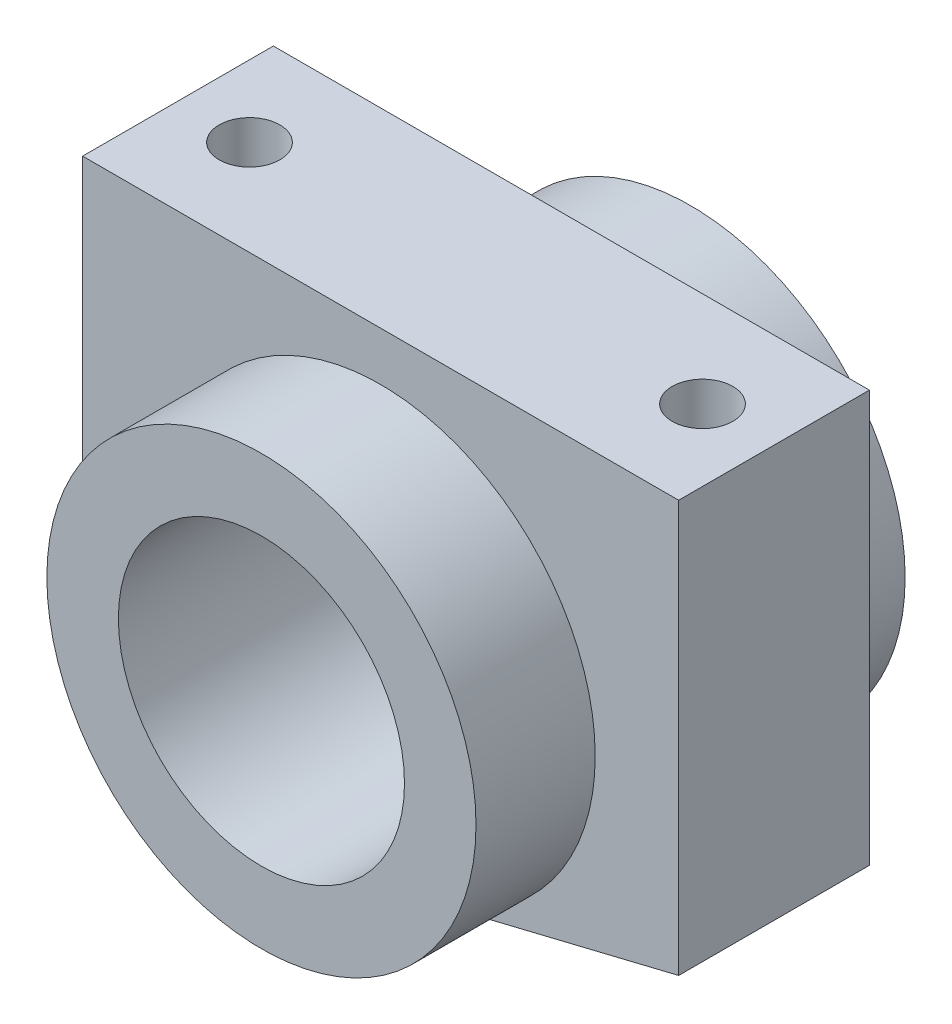
ISO-10303-21;
HEADER;
FILE_DESCRIPTION(('STEP AP214'),'2;1');
FILE_NAME('part.step','',(''),(''),'','','');
FILE_SCHEMA(('AUTOMOTIVE_DESIGN { 1 0 10303 214 1 1 1 1 }'));
ENDSEC;
DATA;
#1=APPLICATION_CONTEXT('core data for automotive mechanical design processes');
#2=APPLICATION_PROTOCOL_DEFINITION('international standard','automotive_design',2000,#1);
#3=PRODUCT_CONTEXT('',#1,'mechanical');
#4=PRODUCT('Part','Part','',(#3));
#5=PRODUCT_RELATED_PRODUCT_CATEGORY('part','',(#4));
#6=PRODUCT_DEFINITION_FORMATION('','',#4);
#7=PRODUCT_DEFINITION_CONTEXT('part definition',#1,'design');
#8=PRODUCT_DEFINITION('design','',#6,#7);
#9=PRODUCT_DEFINITION_SHAPE('','',#8);
#10=(LENGTH_UNIT() NAMED_UNIT(*) SI_UNIT(.MILLI.,.METRE.));
#11=(NAMED_UNIT(*) PLANE_ANGLE_UNIT() SI_UNIT($,.RADIAN.));
#12=(NAMED_UNIT(*) SI_UNIT($,.STERADIAN.) SOLID_ANGLE_UNIT());
#13=UNCERTAINTY_MEASURE_WITH_UNIT(LENGTH_MEASURE(1.E-05),#10,'distance_accuracy_value','');
#14=(GEOMETRIC_REPRESENTATION_CONTEXT(3) GLOBAL_UNCERTAINTY_ASSIGNED_CONTEXT((#13)) GLOBAL_UNIT_ASSIGNED_CONTEXT((#10,
#11,#12)) REPRESENTATION_CONTEXT('',''));
#15=CARTESIAN_POINT('',(0.,0.,0.));
#16=DIRECTION('',(0.,0.,1.));
#17=DIRECTION('',(1.,0.,0.));
#18=AXIS2_PLACEMENT_3D('',#15,#16,#17);
#19=CARTESIAN_POINT('',(0.,0.,6.35));
#20=DIRECTION('',(0.,0.,-1.));
#21=DIRECTION('',(-1.,0.,0.));
#22=AXIS2_PLACEMENT_3D('',#19,#20,#21);
#23=PLANE('',#22);
#24=DIRECTION('',(0.,1.,0.));
#25=VECTOR('',#24,1.);
#26=CARTESIAN_POINT('',(19.84375,-17.4625,6.35));
#27=LINE('',#26,#25);
#28=CARTESIAN_POINT('',(19.84375,-27.4061495438879,6.35));
#29=VERTEX_POINT('',#28);
#30=CARTESIAN_POINT('',(19.84375,0.,6.35));
#31=VERTEX_POINT('',#30);
#32=EDGE_CURVE('E92',#29,#31,#27,.T.);
#33=ORIENTED_EDGE('',*,*,#32,.T.);
#34=DIRECTION('',(-1.,0.,0.));
#35=VECTOR('',#34,1.);
#36=CARTESIAN_POINT('',(19.84375,0.,6.35));
#37=LINE('',#36,#35);
#38=CARTESIAN_POINT('',(-19.84375,0.,6.35));
#39=VERTEX_POINT('',#38);
#40=EDGE_CURVE('E103',#31,#39,#37,.T.);
#41=ORIENTED_EDGE('',*,*,#40,.T.);
#42=DIRECTION('',(0.,-1.,0.));
#43=VECTOR('',#42,1.);
#44=CARTESIAN_POINT('',(-19.84375,0.,6.35));
#45=LINE('',#44,#43);
#46=CARTESIAN_POINT('',(-19.84375,-27.4061495438879,6.35));
#47=VERTEX_POINT('',#46);
#48=EDGE_CURVE('E97',#39,#47,#45,.T.);
#49=ORIENTED_EDGE('',*,*,#48,.T.);
#50=DIRECTION('',(0.971604465177255,-0.23661099561859,0.));
#51=VECTOR('',#50,1.);
#52=CARTESIAN_POINT('',(-19.84375,-27.4061495438879,6.35));
#53=LINE('',#52,#51);
#54=CARTESIAN_POINT('',(0.,-32.2386195587821,6.35));
#55=VERTEX_POINT('',#54);
#56=EDGE_CURVE('E101',#47,#55,#53,.T.);
#57=ORIENTED_EDGE('',*,*,#56,.T.);
#58=DIRECTION('',(0.971604465177255,0.23661099561859,0.));
#59=VECTOR('',#58,1.);
#60=CARTESIAN_POINT('',(19.84375,-27.4061495438879,6.35));
#61=LINE('',#60,#59);
#62=EDGE_CURVE('E59',#55,#29,#61,.T.);
#63=ORIENTED_EDGE('',*,*,#62,.T.);
#64=EDGE_LOOP('',(#33,#41,#49,#57,#63));
#65=FACE_BOUND('',#64,.T.);
#66=CARTESIAN_POINT('',(0.,-17.5335111570364,6.35));
#67=DIRECTION('',(0.,0.,-1.));
#68=DIRECTION('',(-1.,0.,0.));
#69=AXIS2_PLACEMENT_3D('',#66,#67,#68);
#70=CIRCLE('',#69,14.2875);
#71=CARTESIAN_POINT('',(-14.2875,-17.5335111570364,6.35));
#72=VERTEX_POINT('',#71);
#73=EDGE_CURVE('E11',#72,#72,#70,.F.);
#74=ORIENTED_EDGE('',*,*,#73,.F.);
#75=EDGE_LOOP('',(#74));
#76=FACE_BOUND('',#75,.T.);
#77=ADVANCED_FACE('F39',(#65,#76),#23,.F.);
#78=CARTESIAN_POINT('',(0.,0.,-6.35));
#79=DIRECTION('',(0.,0.,-1.));
#80=DIRECTION('',(-1.,0.,0.));
#81=AXIS2_PLACEMENT_3D('',#78,#79,#80);
#82=PLANE('',#81);
#83=DIRECTION('',(0.,1.,0.));
#84=VECTOR('',#83,1.);
#85=CARTESIAN_POINT('',(19.84375,0.,-6.35));
#86=LINE('',#85,#84);
#87=CARTESIAN_POINT('',(19.84375,-27.4061495438879,-6.35));
#88=VERTEX_POINT('',#87);
#89=CARTESIAN_POINT('',(19.84375,0.,-6.35));
#90=VERTEX_POINT('',#89);
#91=EDGE_CURVE('E86',#88,#90,#86,.T.);
#92=ORIENTED_EDGE('',*,*,#91,.F.);
#93=DIRECTION('',(0.971604465177255,0.23661099561859,0.));
#94=VECTOR('',#93,1.);
#95=CARTESIAN_POINT('',(19.84375,-27.4061495438879,-6.35));
#96=LINE('',#95,#94);
#97=CARTESIAN_POINT('',(0.,-32.2386195587821,-6.35));
#98=VERTEX_POINT('',#97);
#99=EDGE_CURVE('E134',#98,#88,#96,.T.);
#100=ORIENTED_EDGE('',*,*,#99,.F.);
#101=DIRECTION('',(0.971604465177255,-0.23661099561859,0.));
#102=VECTOR('',#101,1.);
#103=CARTESIAN_POINT('',(-19.84375,-27.4061495438879,-6.35));
#104=LINE('',#103,#102);
#105=CARTESIAN_POINT('',(-19.84375,-27.4061495438879,-6.35));
#106=VERTEX_POINT('',#105);
#107=EDGE_CURVE('E79',#106,#98,#104,.T.);
#108=ORIENTED_EDGE('',*,*,#107,.F.);
#109=DIRECTION('',(0.,-1.,0.));
#110=VECTOR('',#109,1.);
#111=CARTESIAN_POINT('',(-19.84375,-17.4625,-6.35));
#112=LINE('',#111,#110);
#113=CARTESIAN_POINT('',(-19.84375,0.,-6.35));
#114=VERTEX_POINT('',#113);
#115=EDGE_CURVE('E111',#114,#106,#112,.T.);
#116=ORIENTED_EDGE('',*,*,#115,.F.);
#117=DIRECTION('',(-1.,0.,0.));
#118=VECTOR('',#117,1.);
#119=CARTESIAN_POINT('',(19.84375,0.,-6.35));
#120=LINE('',#119,#118);
#121=EDGE_CURVE('E126',#90,#114,#120,.T.);
#122=ORIENTED_EDGE('',*,*,#121,.F.);
#123=EDGE_LOOP('',(#92,#100,#108,#116,#122));
#124=FACE_BOUND('',#123,.T.);
#125=CARTESIAN_POINT('',(0.,-17.5335111570364,-6.35));
#126=DIRECTION('',(0.,0.,-1.));
#127=DIRECTION('',(-1.,0.,0.));
#128=AXIS2_PLACEMENT_3D('',#125,#126,#127);
#129=CIRCLE('',#128,14.2875);
#130=CARTESIAN_POINT('',(-14.2875,-17.5335111570364,-6.35));
#131=VERTEX_POINT('',#130);
#132=EDGE_CURVE('E43',#131,#131,#129,.F.);
#133=ORIENTED_EDGE('',*,*,#132,.T.);
#134=EDGE_LOOP('',(#133));
#135=FACE_BOUND('',#134,.T.);
#136=ADVANCED_FACE('F148',(#124,#135),#82,.T.);
#137=CARTESIAN_POINT('',(19.84375,0.,6.35));
#138=DIRECTION('',(-1.,0.,0.));
#139=DIRECTION('',(0.,-1.,0.));
#140=AXIS2_PLACEMENT_3D('',#137,#138,#139);
#141=PLANE('',#140);
#142=ORIENTED_EDGE('',*,*,#91,.T.);
#143=DIRECTION('',(0.,0.,-1.));
#144=VECTOR('',#143,1.);
#145=CARTESIAN_POINT('',(19.84375,0.,6.35));
#146=LINE('',#145,#144);
#147=EDGE_CURVE('E50',#31,#90,#146,.T.);
#148=ORIENTED_EDGE('',*,*,#147,.F.);
#149=ORIENTED_EDGE('',*,*,#32,.F.);
#150=DIRECTION('',(0.,0.,-1.));
#151=VECTOR('',#150,1.);
#152=CARTESIAN_POINT('',(19.84375,-27.4061495438879,6.35));
#153=LINE('',#152,#151);
#154=EDGE_CURVE('E120',#29,#88,#153,.T.);
#155=ORIENTED_EDGE('',*,*,#154,.T.);
#156=EDGE_LOOP('',(#142,#148,#149,#155));
#157=FACE_BOUND('',#156,.T.);
#158=ADVANCED_FACE('F41',(#157),#141,.F.);
#159=CARTESIAN_POINT('',(19.84375,0.,6.35));
#160=DIRECTION('',(0.,-1.,0.));
#161=DIRECTION('',(0.,0.,-1.));
#162=AXIS2_PLACEMENT_3D('',#159,#160,#161);
#163=PLANE('',#162);
#164=CARTESIAN_POINT('',(-15.08125,0.,0.));
#165=DIRECTION('',(0.,1.,0.));
#166=DIRECTION('',(0.,0.,1.));
#167=AXIS2_PLACEMENT_3D('',#164,#165,#166);
#168=CIRCLE('',#167,2.0193);
#169=CARTESIAN_POINT('',(-15.08125,0.,2.0193));
#170=VERTEX_POINT('',#169);
#171=EDGE_CURVE('E169',#170,#170,#168,.T.);
#172=ORIENTED_EDGE('',*,*,#171,.F.);
#173=EDGE_LOOP('',(#172));
#174=FACE_BOUND('',#173,.T.);
#175=CARTESIAN_POINT('',(15.08125,0.,0.));
#176=DIRECTION('',(0.,1.,0.));
#177=DIRECTION('',(0.,0.,-1.));
#178=AXIS2_PLACEMENT_3D('',#175,#176,#177);
#179=CIRCLE('',#178,2.0193);
#180=CARTESIAN_POINT('',(15.08125,0.,-2.0193));
#181=VERTEX_POINT('',#180);
#182=EDGE_CURVE('E173',#181,#181,#179,.T.);
#183=ORIENTED_EDGE('',*,*,#182,.F.);
#184=EDGE_LOOP('',(#183));
#185=FACE_BOUND('',#184,.T.);
#186=ORIENTED_EDGE('',*,*,#121,.T.);
#187=DIRECTION('',(0.,0.,-1.));
#188=VECTOR('',#187,1.);
#189=CARTESIAN_POINT('',(-19.84375,0.,6.35));
#190=LINE('',#189,#188);
#191=EDGE_CURVE('E113',#39,#114,#190,.T.);
#192=ORIENTED_EDGE('',*,*,#191,.F.);
#193=ORIENTED_EDGE('',*,*,#40,.F.);
#194=ORIENTED_EDGE('',*,*,#147,.T.);
#195=EDGE_LOOP('',(#186,#192,#193,#194));
#196=FACE_BOUND('',#195,.T.);
#197=ADVANCED_FACE('F146',(#174,#185,#196),#163,.F.);
#198=CARTESIAN_POINT('',(-19.84375,-17.4625,6.35));
#199=DIRECTION('',(1.,0.,0.));
#200=DIRECTION('',(0.,0.,-1.));
#201=AXIS2_PLACEMENT_3D('',#198,#199,#200);
#202=PLANE('',#201);
#203=ORIENTED_EDGE('',*,*,#115,.T.);
#204=DIRECTION('',(0.,0.,-1.));
#205=VECTOR('',#204,1.);
#206=CARTESIAN_POINT('',(-19.84375,-27.4061495438879,6.35));
#207=LINE('',#206,#205);
#208=EDGE_CURVE('E109',#47,#106,#207,.T.);
#209=ORIENTED_EDGE('',*,*,#208,.F.);
#210=ORIENTED_EDGE('',*,*,#48,.F.);
#211=ORIENTED_EDGE('',*,*,#191,.T.);
#212=EDGE_LOOP('',(#203,#209,#210,#211));
#213=FACE_BOUND('',#212,.T.);
#214=ADVANCED_FACE('F110',(#213),#202,.F.);
#215=CARTESIAN_POINT('',(-19.84375,-27.4061495438879,6.35));
#216=DIRECTION('',(0.23661099561859,0.971604465177255,0.));
#217=DIRECTION('',(-0.971604465177255,0.23661099561859,0.));
#218=AXIS2_PLACEMENT_3D('',#215,#216,#217);
#219=PLANE('',#218);
#220=CARTESIAN_POINT('',(-15.08125,-28.5659423474625,0.));
#221=DIRECTION('',(0.23661099561859,0.971604465177255,0.));
#222=DIRECTION('',(-0.971604465177255,0.23661099561859,0.));
#223=AXIS2_PLACEMENT_3D('',#220,#221,#222);
#224=ELLIPSE('',#223,2.07831486203762,2.0193);
#225=CARTESIAN_POINT('',(-17.10055,-28.0741901987468,0.));
#226=VERTEX_POINT('',#225);
#227=EDGE_CURVE('E184',#226,#226,#224,.T.);
#228=ORIENTED_EDGE('',*,*,#227,.T.);
#229=EDGE_LOOP('',(#228));
#230=FACE_BOUND('',#229,.T.);
#231=ORIENTED_EDGE('',*,*,#107,.T.);
#232=DIRECTION('',(0.,0.,-1.));
#233=VECTOR('',#232,1.);
#234=CARTESIAN_POINT('',(0.,-32.2386195587821,6.35));
#235=LINE('',#234,#233);
#236=EDGE_CURVE('E114',#55,#98,#235,.T.);
#237=ORIENTED_EDGE('',*,*,#236,.F.);
#238=ORIENTED_EDGE('',*,*,#56,.F.);
#239=ORIENTED_EDGE('',*,*,#208,.T.);
#240=EDGE_LOOP('',(#231,#237,#238,#239));
#241=FACE_BOUND('',#240,.T.);
#242=ADVANCED_FACE('F116',(#230,#241),#219,.F.);
#243=CARTESIAN_POINT('',(19.84375,-27.4061495438879,6.35));
#244=DIRECTION('',(-0.23661099561859,0.971604465177255,0.));
#245=DIRECTION('',(-0.971604465177255,-0.23661099561859,0.));
#246=AXIS2_PLACEMENT_3D('',#243,#244,#245);
#247=PLANE('',#246);
#248=CARTESIAN_POINT('',(15.08125,-28.5659423474625,0.));
#249=DIRECTION('',(-0.23661099561859,0.971604465177255,0.));
#250=DIRECTION('',(0.971604465177255,0.23661099561859,0.));
#251=AXIS2_PLACEMENT_3D('',#248,#249,#250);
#252=ELLIPSE('',#251,2.07831486203762,2.0193);
#253=CARTESIAN_POINT('',(17.10055,-28.0741901987468,0.));
#254=VERTEX_POINT('',#253);
#255=EDGE_CURVE('E177',#254,#254,#252,.T.);
#256=ORIENTED_EDGE('',*,*,#255,.T.);
#257=EDGE_LOOP('',(#256));
#258=FACE_BOUND('',#257,.T.);
#259=ORIENTED_EDGE('',*,*,#99,.T.);
#260=ORIENTED_EDGE('',*,*,#154,.F.);
#261=ORIENTED_EDGE('',*,*,#62,.F.);
#262=ORIENTED_EDGE('',*,*,#236,.T.);
#263=EDGE_LOOP('',(#259,#260,#261,#262));
#264=FACE_BOUND('',#263,.T.);
#265=ADVANCED_FACE('F151',(#258,#264),#247,.F.);
#266=CARTESIAN_POINT('',(0.,-17.5335111570364,14.2875));
#267=DIRECTION('',(0.,0.,-1.));
#268=DIRECTION('',(-1.,0.,0.));
#269=AXIS2_PLACEMENT_3D('',#266,#267,#268);
#270=CYLINDRICAL_SURFACE('',#269,14.2875);
#271=ORIENTED_EDGE('',*,*,#132,.F.);
#272=EDGE_LOOP('',(#271));
#273=FACE_BOUND('',#272,.T.);
#274=CARTESIAN_POINT('',(0.,-17.5335111570364,-14.2875));
#275=DIRECTION('',(0.,0.,1.));
#276=DIRECTION('',(1.,0.,0.));
#277=AXIS2_PLACEMENT_3D('',#274,#275,#276);
#278=CIRCLE('',#277,14.2875);
#279=CARTESIAN_POINT('',(14.2875,-17.5335111570364,-14.2875));
#280=VERTEX_POINT('',#279);
#281=EDGE_CURVE('E156',#280,#280,#278,.T.);
#282=ORIENTED_EDGE('',*,*,#281,.T.);
#283=EDGE_LOOP('',(#282));
#284=FACE_BOUND('',#283,.T.);
#285=ADVANCED_FACE('F213',(#273,#284),#270,.T.);
#286=CARTESIAN_POINT('',(0.,-17.5335111570364,-14.2875));
#287=DIRECTION('',(0.,0.,1.));
#288=DIRECTION('',(1.,0.,0.));
#289=AXIS2_PLACEMENT_3D('',#286,#287,#288);
#290=PLANE('',#289);
#291=ORIENTED_EDGE('',*,*,#281,.F.);
#292=EDGE_LOOP('',(#291));
#293=FACE_BOUND('',#292,.T.);
#294=CARTESIAN_POINT('',(0.,-17.5335111570364,-14.2875));
#295=DIRECTION('',(0.,0.,1.));
#296=DIRECTION('',(1.,0.,0.));
#297=AXIS2_PLACEMENT_3D('',#294,#295,#296);
#298=CIRCLE('',#297,9.525);
#299=CARTESIAN_POINT('',(9.525,-17.5335111570364,-14.2875));
#300=VERTEX_POINT('',#299);
#301=EDGE_CURVE('E165',#300,#300,#298,.T.);
#302=ORIENTED_EDGE('',*,*,#301,.T.);
#303=EDGE_LOOP('',(#302));
#304=FACE_BOUND('',#303,.T.);
#305=ADVANCED_FACE('F247',(#293,#304),#290,.F.);
#306=CARTESIAN_POINT('',(0.,-17.5335111570364,6.35));
#307=DIRECTION('',(0.,0.,-1.));
#308=DIRECTION('',(-1.,0.,0.));
#309=AXIS2_PLACEMENT_3D('',#306,#307,#308);
#310=CYLINDRICAL_SURFACE('',#309,9.525);
#311=ORIENTED_EDGE('',*,*,#301,.F.);
#312=EDGE_LOOP('',(#311));
#313=FACE_BOUND('',#312,.T.);
#314=CARTESIAN_POINT('',(0.,-17.5335111570364,14.2875));
#315=DIRECTION('',(0.,0.,1.));
#316=DIRECTION('',(1.,0.,0.));
#317=AXIS2_PLACEMENT_3D('',#314,#315,#316);
#318=CIRCLE('',#317,9.525);
#319=CARTESIAN_POINT('',(9.525,-17.5335111570364,14.2875));
#320=VERTEX_POINT('',#319);
#321=EDGE_CURVE('E161',#320,#320,#318,.T.);
#322=ORIENTED_EDGE('',*,*,#321,.T.);
#323=EDGE_LOOP('',(#322));
#324=FACE_BOUND('',#323,.T.);
#325=ADVANCED_FACE('F208',(#313,#324),#310,.F.);
#326=CARTESIAN_POINT('',(0.,-17.5335111570364,14.2875));
#327=DIRECTION('',(0.,0.,1.));
#328=DIRECTION('',(1.,0.,0.));
#329=AXIS2_PLACEMENT_3D('',#326,#327,#328);
#330=CIRCLE('',#329,14.2875);
#331=CARTESIAN_POINT('',(14.2875,-17.5335111570364,14.2875));
#332=VERTEX_POINT('',#331);
#333=EDGE_CURVE('E160',#332,#332,#330,.T.);
#334=ORIENTED_EDGE('',*,*,#333,.F.);
#335=EDGE_LOOP('',(#334));
#336=FACE_BOUND('',#335,.T.);
#337=ORIENTED_EDGE('',*,*,#73,.T.);
#338=EDGE_LOOP('',(#337));
#339=FACE_BOUND('',#338,.T.);
#340=ADVANCED_FACE('F249',(#336,#339),#270,.T.);
#341=CARTESIAN_POINT('',(0.,-17.5335111570364,14.2875));
#342=DIRECTION('',(0.,0.,1.));
#343=DIRECTION('',(1.,0.,0.));
#344=AXIS2_PLACEMENT_3D('',#341,#342,#343);
#345=PLANE('',#344);
#346=ORIENTED_EDGE('',*,*,#333,.T.);
#347=EDGE_LOOP('',(#346));
#348=FACE_BOUND('',#347,.T.);
#349=ORIENTED_EDGE('',*,*,#321,.F.);
#350=EDGE_LOOP('',(#349));
#351=FACE_BOUND('',#350,.T.);
#352=ADVANCED_FACE('F198',(#348,#351),#345,.T.);
#353=CARTESIAN_POINT('',(15.08125,-17.4625,0.));
#354=DIRECTION('',(0.,1.,0.));
#355=DIRECTION('',(0.,0.,1.));
#356=AXIS2_PLACEMENT_3D('',#353,#354,#355);
#357=CYLINDRICAL_SURFACE('',#356,2.0193);
#358=ORIENTED_EDGE('',*,*,#182,.T.);
#359=EDGE_LOOP('',(#358));
#360=FACE_BOUND('',#359,.T.);
#361=ORIENTED_EDGE('',*,*,#255,.F.);
#362=EDGE_LOOP('',(#361));
#363=FACE_BOUND('',#362,.T.);
#364=ADVANCED_FACE('F192',(#360,#363),#357,.F.);
#365=CARTESIAN_POINT('',(-15.08125,-17.4625,0.));
#366=DIRECTION('',(0.,1.,0.));
#367=DIRECTION('',(0.,0.,1.));
#368=AXIS2_PLACEMENT_3D('',#365,#366,#367);
#369=CYLINDRICAL_SURFACE('',#368,2.0193);
#370=ORIENTED_EDGE('',*,*,#171,.T.);
#371=EDGE_LOOP('',(#370));
#372=FACE_BOUND('',#371,.T.);
#373=ORIENTED_EDGE('',*,*,#227,.F.);
#374=EDGE_LOOP('',(#373));
#375=FACE_BOUND('',#374,.T.);
#376=ADVANCED_FACE('F190',(#372,#375),#369,.F.);
#377=CLOSED_SHELL('',(#77,#136,#158,#197,#214,#242,#265,#285,#305,#325,#340,#352,#364,#376));
#378=MANIFOLD_SOLID_BREP('B2',#377);
#379=ADVANCED_BREP_SHAPE_REPRESENTATION('',(#18,#378),#14);
#380=SHAPE_DEFINITION_REPRESENTATION(#9,#379);
ENDSEC;
END-ISO-10303-21;
